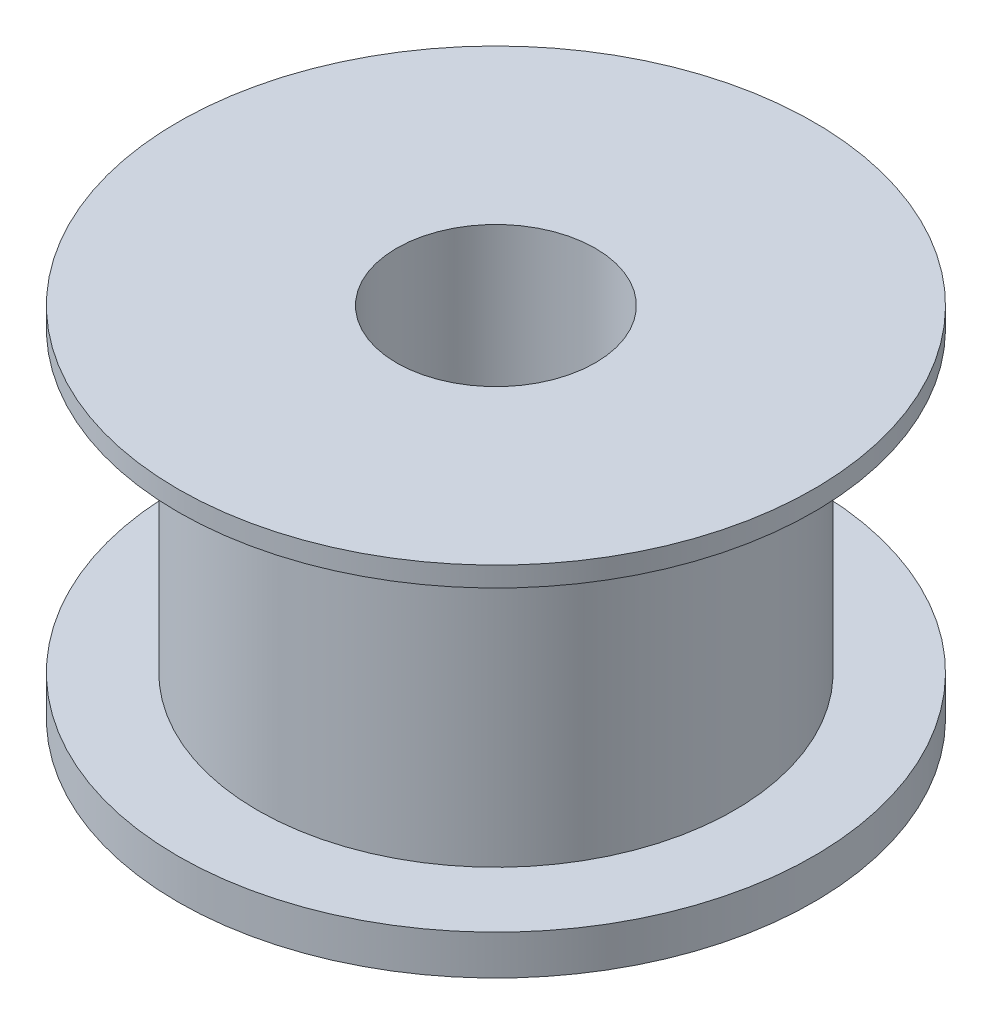
ISO-10303-21;
HEADER;
FILE_DESCRIPTION(('STEP AP214'),'2;1');
FILE_NAME('part.step','',(''),(''),'','','');
FILE_SCHEMA(('AUTOMOTIVE_DESIGN { 1 0 10303 214 1 1 1 1 }'));
ENDSEC;
DATA;
#1=APPLICATION_CONTEXT('core data for automotive mechanical design processes');
#2=APPLICATION_PROTOCOL_DEFINITION('international standard','automotive_design',2000,#1);
#3=PRODUCT_CONTEXT('',#1,'mechanical');
#4=PRODUCT('Part','Part','',(#3));
#5=PRODUCT_RELATED_PRODUCT_CATEGORY('part','',(#4));
#6=PRODUCT_DEFINITION_FORMATION('','',#4);
#7=PRODUCT_DEFINITION_CONTEXT('part definition',#1,'design');
#8=PRODUCT_DEFINITION('design','',#6,#7);
#9=PRODUCT_DEFINITION_SHAPE('','',#8);
#10=(LENGTH_UNIT() NAMED_UNIT(*) SI_UNIT(.MILLI.,.METRE.));
#11=(NAMED_UNIT(*) PLANE_ANGLE_UNIT() SI_UNIT($,.RADIAN.));
#12=(NAMED_UNIT(*) SI_UNIT($,.STERADIAN.) SOLID_ANGLE_UNIT());
#13=UNCERTAINTY_MEASURE_WITH_UNIT(LENGTH_MEASURE(1.E-05),#10,'distance_accuracy_value','');
#14=(GEOMETRIC_REPRESENTATION_CONTEXT(3) GLOBAL_UNCERTAINTY_ASSIGNED_CONTEXT((#13)) GLOBAL_UNIT_ASSIGNED_CONTEXT((#10,
#11,#12)) REPRESENTATION_CONTEXT('',''));
#15=CARTESIAN_POINT('',(0.,0.,0.));
#16=DIRECTION('',(0.,0.,1.));
#17=DIRECTION('',(1.,0.,0.));
#18=AXIS2_PLACEMENT_3D('',#15,#16,#17);
#19=CARTESIAN_POINT('',(0.,1.,0.));
#20=DIRECTION('',(0.,-1.,0.));
#21=DIRECTION('',(0.,0.,-1.));
#22=AXIS2_PLACEMENT_3D('',#19,#20,#21);
#23=CYLINDRICAL_SURFACE('',#22,8.);
#24=CARTESIAN_POINT('',(0.,1.,0.));
#25=DIRECTION('',(0.,1.,0.));
#26=DIRECTION('',(0.,0.,1.));
#27=AXIS2_PLACEMENT_3D('',#24,#25,#26);
#28=CIRCLE('',#27,8.);
#29=CARTESIAN_POINT('',(0.,1.,8.));
#30=VERTEX_POINT('',#29);
#31=EDGE_CURVE('E47',#30,#30,#28,.T.);
#32=ORIENTED_EDGE('',*,*,#31,.F.);
#33=EDGE_LOOP('',(#32));
#34=FACE_BOUND('',#33,.T.);
#35=CARTESIAN_POINT('',(0.,0.,0.));
#36=DIRECTION('',(0.,1.,0.));
#37=DIRECTION('',(0.,0.,1.));
#38=AXIS2_PLACEMENT_3D('',#35,#36,#37);
#39=CIRCLE('',#38,8.);
#40=CARTESIAN_POINT('',(0.,0.,8.));
#41=VERTEX_POINT('',#40);
#42=EDGE_CURVE('E42',#41,#41,#39,.T.);
#43=ORIENTED_EDGE('',*,*,#42,.T.);
#44=EDGE_LOOP('',(#43));
#45=FACE_BOUND('',#44,.T.);
#46=ADVANCED_FACE('F39',(#34,#45),#23,.T.);
#47=CARTESIAN_POINT('',(0.,1.,0.));
#48=DIRECTION('',(0.,1.,0.));
#49=DIRECTION('',(0.,0.,1.));
#50=AXIS2_PLACEMENT_3D('',#47,#48,#49);
#51=PLANE('',#50);
#52=CARTESIAN_POINT('',(0.,1.,0.));
#53=DIRECTION('',(0.,1.,0.));
#54=DIRECTION('',(0.,0.,1.));
#55=AXIS2_PLACEMENT_3D('',#52,#53,#54);
#56=CIRCLE('',#55,6.);
#57=CARTESIAN_POINT('',(0.,1.,6.));
#58=VERTEX_POINT('',#57);
#59=EDGE_CURVE('E10',#58,#58,#56,.T.);
#60=ORIENTED_EDGE('',*,*,#59,.F.);
#61=EDGE_LOOP('',(#60));
#62=FACE_BOUND('',#61,.T.);
#63=ORIENTED_EDGE('',*,*,#31,.T.);
#64=EDGE_LOOP('',(#63));
#65=FACE_BOUND('',#64,.T.);
#66=ADVANCED_FACE('F81',(#62,#65),#51,.T.);
#67=CARTESIAN_POINT('',(0.,0.,0.));
#68=DIRECTION('',(0.,1.,0.));
#69=DIRECTION('',(0.,0.,1.));
#70=AXIS2_PLACEMENT_3D('',#67,#68,#69);
#71=PLANE('',#70);
#72=CARTESIAN_POINT('',(0.,0.,0.));
#73=DIRECTION('',(0.,-1.,0.));
#74=DIRECTION('',(0.,0.,-1.));
#75=AXIS2_PLACEMENT_3D('',#72,#73,#74);
#76=CIRCLE('',#75,2.5);
#77=CARTESIAN_POINT('',(0.,0.,-2.5));
#78=VERTEX_POINT('',#77);
#79=EDGE_CURVE('E63',#78,#78,#76,.T.);
#80=ORIENTED_EDGE('',*,*,#79,.F.);
#81=EDGE_LOOP('',(#80));
#82=FACE_BOUND('',#81,.T.);
#83=ORIENTED_EDGE('',*,*,#42,.F.);
#84=EDGE_LOOP('',(#83));
#85=FACE_BOUND('',#84,.T.);
#86=ADVANCED_FACE('F77',(#82,#85),#71,.F.);
#87=CARTESIAN_POINT('',(0.,8.5,0.));
#88=DIRECTION('',(0.,-1.,0.));
#89=DIRECTION('',(0.,0.,-1.));
#90=AXIS2_PLACEMENT_3D('',#87,#88,#89);
#91=CYLINDRICAL_SURFACE('',#90,6.);
#92=CARTESIAN_POINT('',(0.,8.5,0.));
#93=DIRECTION('',(0.,1.,0.));
#94=DIRECTION('',(0.,0.,1.));
#95=AXIS2_PLACEMENT_3D('',#92,#93,#94);
#96=CIRCLE('',#95,6.);
#97=CARTESIAN_POINT('',(0.,8.5,6.));
#98=VERTEX_POINT('',#97);
#99=EDGE_CURVE('E54',#98,#98,#96,.T.);
#100=ORIENTED_EDGE('',*,*,#99,.F.);
#101=EDGE_LOOP('',(#100));
#102=FACE_BOUND('',#101,.T.);
#103=ORIENTED_EDGE('',*,*,#59,.T.);
#104=EDGE_LOOP('',(#103));
#105=FACE_BOUND('',#104,.T.);
#106=ADVANCED_FACE('F80',(#102,#105),#91,.T.);
#107=CARTESIAN_POINT('',(0.,9.,0.));
#108=DIRECTION('',(0.,-1.,0.));
#109=DIRECTION('',(0.,0.,-1.));
#110=AXIS2_PLACEMENT_3D('',#107,#108,#109);
#111=CYLINDRICAL_SURFACE('',#110,8.);
#112=CARTESIAN_POINT('',(0.,9.,0.));
#113=DIRECTION('',(0.,1.,0.));
#114=DIRECTION('',(0.,0.,1.));
#115=AXIS2_PLACEMENT_3D('',#112,#113,#114);
#116=CIRCLE('',#115,8.);
#117=CARTESIAN_POINT('',(0.,9.,8.));
#118=VERTEX_POINT('',#117);
#119=EDGE_CURVE('E58',#118,#118,#116,.T.);
#120=ORIENTED_EDGE('',*,*,#119,.F.);
#121=EDGE_LOOP('',(#120));
#122=FACE_BOUND('',#121,.T.);
#123=CARTESIAN_POINT('',(0.,8.5,0.));
#124=DIRECTION('',(0.,1.,0.));
#125=DIRECTION('',(0.,0.,1.));
#126=AXIS2_PLACEMENT_3D('',#123,#124,#125);
#127=CIRCLE('',#126,8.);
#128=CARTESIAN_POINT('',(0.,8.5,8.));
#129=VERTEX_POINT('',#128);
#130=EDGE_CURVE('E59',#129,#129,#127,.T.);
#131=ORIENTED_EDGE('',*,*,#130,.T.);
#132=EDGE_LOOP('',(#131));
#133=FACE_BOUND('',#132,.T.);
#134=ADVANCED_FACE('F100',(#122,#133),#111,.T.);
#135=CARTESIAN_POINT('',(0.,9.,0.));
#136=DIRECTION('',(0.,1.,0.));
#137=DIRECTION('',(0.,0.,1.));
#138=AXIS2_PLACEMENT_3D('',#135,#136,#137);
#139=PLANE('',#138);
#140=CARTESIAN_POINT('',(0.,9.,0.));
#141=DIRECTION('',(0.,1.,0.));
#142=DIRECTION('',(0.,0.,1.));
#143=AXIS2_PLACEMENT_3D('',#140,#141,#142);
#144=CIRCLE('',#143,2.5);
#145=CARTESIAN_POINT('',(0.,9.,2.5));
#146=VERTEX_POINT('',#145);
#147=EDGE_CURVE('E67',#146,#146,#144,.F.);
#148=ORIENTED_EDGE('',*,*,#147,.T.);
#149=EDGE_LOOP('',(#148));
#150=FACE_BOUND('',#149,.T.);
#151=ORIENTED_EDGE('',*,*,#119,.T.);
#152=EDGE_LOOP('',(#151));
#153=FACE_BOUND('',#152,.T.);
#154=ADVANCED_FACE('F104',(#150,#153),#139,.T.);
#155=CARTESIAN_POINT('',(0.,8.5,0.));
#156=DIRECTION('',(0.,1.,0.));
#157=DIRECTION('',(0.,0.,1.));
#158=AXIS2_PLACEMENT_3D('',#155,#156,#157);
#159=PLANE('',#158);
#160=ORIENTED_EDGE('',*,*,#99,.T.);
#161=EDGE_LOOP('',(#160));
#162=FACE_BOUND('',#161,.T.);
#163=ORIENTED_EDGE('',*,*,#130,.F.);
#164=EDGE_LOOP('',(#163));
#165=FACE_BOUND('',#164,.T.);
#166=ADVANCED_FACE('F106',(#162,#165),#159,.F.);
#167=CARTESIAN_POINT('',(0.,9.001,0.));
#168=DIRECTION('',(0.,-1.,0.));
#169=DIRECTION('',(0.,0.,-1.));
#170=AXIS2_PLACEMENT_3D('',#167,#168,#169);
#171=CYLINDRICAL_SURFACE('',#170,2.5);
#172=ORIENTED_EDGE('',*,*,#147,.F.);
#173=EDGE_LOOP('',(#172));
#174=FACE_BOUND('',#173,.T.);
#175=ORIENTED_EDGE('',*,*,#79,.T.);
#176=EDGE_LOOP('',(#175));
#177=FACE_BOUND('',#176,.T.);
#178=ADVANCED_FACE('F75',(#174,#177),#171,.F.);
#179=CLOSED_SHELL('',(#46,#66,#86,#106,#134,#154,#166,#178));
#180=MANIFOLD_SOLID_BREP('B2',#179);
#181=ADVANCED_BREP_SHAPE_REPRESENTATION('',(#18,#180),#14);
#182=SHAPE_DEFINITION_REPRESENTATION(#9,#181);
ENDSEC;
END-ISO-10303-21;
